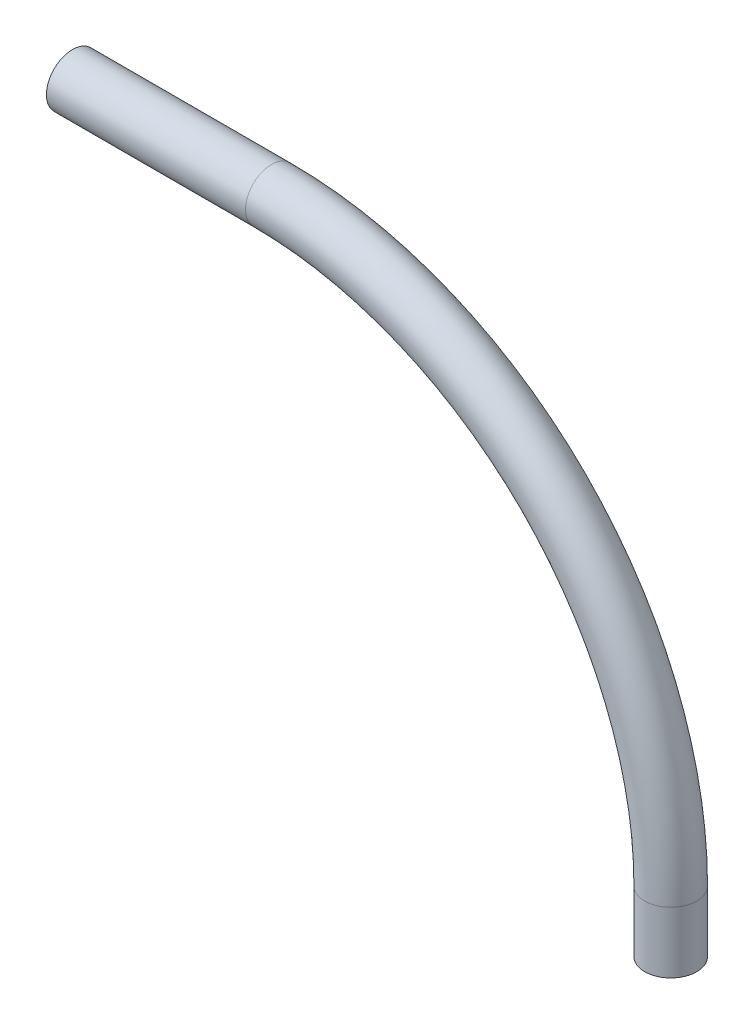
ISO-10303-21;
HEADER;
FILE_DESCRIPTION(('STEP AP214'),'2;1');
FILE_NAME('part.step','',(''),(''),'','','');
FILE_SCHEMA(('AUTOMOTIVE_DESIGN { 1 0 10303 214 1 1 1 1 }'));
ENDSEC;
DATA;
#1=APPLICATION_CONTEXT('core data for automotive mechanical design processes');
#2=APPLICATION_PROTOCOL_DEFINITION('international standard','automotive_design',2000,#1);
#3=PRODUCT_CONTEXT('',#1,'mechanical');
#4=PRODUCT('Part','Part','',(#3));
#5=PRODUCT_RELATED_PRODUCT_CATEGORY('part','',(#4));
#6=PRODUCT_DEFINITION_FORMATION('','',#4);
#7=PRODUCT_DEFINITION_CONTEXT('part definition',#1,'design');
#8=PRODUCT_DEFINITION('design','',#6,#7);
#9=PRODUCT_DEFINITION_SHAPE('','',#8);
#10=(LENGTH_UNIT() NAMED_UNIT(*) SI_UNIT(.MILLI.,.METRE.));
#11=(NAMED_UNIT(*) PLANE_ANGLE_UNIT() SI_UNIT($,.RADIAN.));
#12=(NAMED_UNIT(*) SI_UNIT($,.STERADIAN.) SOLID_ANGLE_UNIT());
#13=UNCERTAINTY_MEASURE_WITH_UNIT(LENGTH_MEASURE(1.E-05),#10,'distance_accuracy_value','');
#14=(GEOMETRIC_REPRESENTATION_CONTEXT(3) GLOBAL_UNCERTAINTY_ASSIGNED_CONTEXT((#13)) GLOBAL_UNIT_ASSIGNED_CONTEXT((#10,
#11,#12)) REPRESENTATION_CONTEXT('',''));
#15=CARTESIAN_POINT('',(0.,0.,0.));
#16=DIRECTION('',(0.,0.,1.));
#17=DIRECTION('',(1.,0.,0.));
#18=AXIS2_PLACEMENT_3D('',#15,#16,#17);
#19=CARTESIAN_POINT('',(-63.9532912683758,176.442341083977,4.91758167922948));
#20=DIRECTION('',(1.,0.,0.));
#21=DIRECTION('',(0.,0.,-1.));
#22=AXIS2_PLACEMENT_3D('',#19,#20,#21);
#23=CYLINDRICAL_SURFACE('',#22,8.5);
#24=CARTESIAN_POINT('',(1.04670873162423,176.442341083977,4.91758167922948));
#25=DIRECTION('',(1.,0.,0.));
#26=DIRECTION('',(0.,0.,-1.));
#27=AXIS2_PLACEMENT_3D('',#24,#25,#26);
#28=CIRCLE('',#27,8.5);
#29=CARTESIAN_POINT('',(1.04670873162424,184.942341083977,4.91758167922948));
#30=VERTEX_POINT('',#29);
#31=EDGE_CURVE('E57',#30,#30,#28,.T.);
#32=ORIENTED_EDGE('',*,*,#31,.F.);
#33=EDGE_LOOP('',(#32));
#34=FACE_BOUND('',#33,.T.);
#35=CARTESIAN_POINT('',(-63.9532912683758,176.442341083977,4.91758167922948));
#36=DIRECTION('',(1.,0.,0.));
#37=DIRECTION('',(0.,0.,-1.));
#38=AXIS2_PLACEMENT_3D('',#35,#36,#37);
#39=CIRCLE('',#38,8.5);
#40=CARTESIAN_POINT('',(-63.9532912683761,176.442341083977,-3.58241832077052));
#41=VERTEX_POINT('',#40);
#42=EDGE_CURVE('E55',#41,#41,#39,.T.);
#43=ORIENTED_EDGE('',*,*,#42,.T.);
#44=EDGE_LOOP('',(#43));
#45=FACE_BOUND('',#44,.T.);
#46=ADVANCED_FACE('F34',(#34,#45),#23,.T.);
#47=CARTESIAN_POINT('',(1.04670873162397,46.0623410839771,4.91758167922948));
#48=DIRECTION('',(0.,0.,-1.));
#49=DIRECTION('',(-1.,0.,0.));
#50=AXIS2_PLACEMENT_3D('',#47,#48,#49);
#51=TOROIDAL_SURFACE('',#50,130.38,8.5);
#52=CARTESIAN_POINT('',(131.426708731624,46.0623410839744,4.91758167922948));
#53=DIRECTION('',(0.,-1.,0.));
#54=DIRECTION('',(0.,0.,-1.));
#55=AXIS2_PLACEMENT_3D('',#52,#53,#54);
#56=CIRCLE('',#55,8.5);
#57=CARTESIAN_POINT('',(139.926708731624,46.0623410839742,4.91758167922948));
#58=VERTEX_POINT('',#57);
#59=EDGE_CURVE('E38',#58,#58,#56,.T.);
#60=CARTESIAN_POINT('',(1.04670873162397,46.0623410839771,4.91758167922948));
#61=DIRECTION('',(0.,0.,-1.));
#62=DIRECTION('',(-1.,0.,0.));
#63=AXIS2_PLACEMENT_3D('',#60,#61,#62);
#64=CIRCLE('',#63,138.88);
#65=EDGE_CURVE('',#30,#58,#64,.T.);
#66=ORIENTED_EDGE('',*,*,#31,.T.);
#67=ORIENTED_EDGE('',*,*,#59,.F.);
#68=ORIENTED_EDGE('',*,*,#65,.T.);
#69=ORIENTED_EDGE('',*,*,#65,.F.);
#70=EDGE_LOOP('',(#66,#68,#67,#69));
#71=FACE_BOUND('',#70,.T.);
#72=ADVANCED_FACE('F65',(#71),#51,.T.);
#73=CARTESIAN_POINT('',(131.426708731624,46.0623410839743,4.91758167922948));
#74=DIRECTION('',(0.,-1.,0.));
#75=DIRECTION('',(0.,0.,-1.));
#76=AXIS2_PLACEMENT_3D('',#73,#74,#75);
#77=CYLINDRICAL_SURFACE('',#76,8.5);
#78=CARTESIAN_POINT('',(131.426708731624,26.0623410839743,4.91758167922948));
#79=DIRECTION('',(0.,-1.,0.));
#80=DIRECTION('',(0.,0.,-1.));
#81=AXIS2_PLACEMENT_3D('',#78,#79,#80);
#82=CIRCLE('',#81,8.5);
#83=CARTESIAN_POINT('',(131.426708731624,26.0623410839746,-3.58241832077052));
#84=VERTEX_POINT('',#83);
#85=EDGE_CURVE('E51',#84,#84,#82,.T.);
#86=ORIENTED_EDGE('',*,*,#85,.F.);
#87=EDGE_LOOP('',(#86));
#88=FACE_BOUND('',#87,.T.);
#89=ORIENTED_EDGE('',*,*,#59,.T.);
#90=EDGE_LOOP('',(#89));
#91=FACE_BOUND('',#90,.T.);
#92=ADVANCED_FACE('F36',(#88,#91),#77,.T.);
#93=CARTESIAN_POINT('',(-63.9532912683758,176.442341083977,4.91758167922948));
#94=DIRECTION('',(1.,0.,0.));
#95=DIRECTION('',(0.,0.,-1.));
#96=AXIS2_PLACEMENT_3D('',#93,#94,#95);
#97=PLANE('',#96);
#98=CARTESIAN_POINT('',(-63.9532912683758,176.442341083977,4.91758167922948));
#99=DIRECTION('',(1.,0.,0.));
#100=DIRECTION('',(0.,0.,-1.));
#101=AXIS2_PLACEMENT_3D('',#98,#99,#100);
#102=CIRCLE('',#101,4.85);
#103=CARTESIAN_POINT('',(-63.9532912683759,176.442341083977,0.0675816792294849));
#104=VERTEX_POINT('',#103);
#105=EDGE_CURVE('E54',#104,#104,#102,.F.);
#106=ORIENTED_EDGE('',*,*,#105,.F.);
#107=EDGE_LOOP('',(#106));
#108=FACE_BOUND('',#107,.T.);
#109=ORIENTED_EDGE('',*,*,#42,.F.);
#110=EDGE_LOOP('',(#109));
#111=FACE_BOUND('',#110,.T.);
#112=ADVANCED_FACE('F71',(#108,#111),#97,.F.);
#113=CARTESIAN_POINT('',(131.426708731624,26.0623410839743,4.91758167922948));
#114=DIRECTION('',(0.,-1.,0.));
#115=DIRECTION('',(0.,0.,-1.));
#116=AXIS2_PLACEMENT_3D('',#113,#114,#115);
#117=PLANE('',#116);
#118=CARTESIAN_POINT('',(131.426708731624,26.0623410839743,4.91758167922948));
#119=DIRECTION('',(0.,-1.,0.));
#120=DIRECTION('',(0.,0.,-1.));
#121=AXIS2_PLACEMENT_3D('',#118,#119,#120);
#122=CIRCLE('',#121,4.85);
#123=CARTESIAN_POINT('',(131.426708731624,26.0623410839745,0.0675816792294849));
#124=VERTEX_POINT('',#123);
#125=EDGE_CURVE('E10',#124,#124,#122,.F.);
#126=ORIENTED_EDGE('',*,*,#125,.T.);
#127=EDGE_LOOP('',(#126));
#128=FACE_BOUND('',#127,.T.);
#129=ORIENTED_EDGE('',*,*,#85,.T.);
#130=EDGE_LOOP('',(#129));
#131=FACE_BOUND('',#130,.T.);
#132=ADVANCED_FACE('F89',(#128,#131),#117,.T.);
#133=CARTESIAN_POINT('',(-63.9532912683758,176.442341083977,4.91758167922948));
#134=DIRECTION('',(1.,0.,0.));
#135=DIRECTION('',(0.,0.,-1.));
#136=AXIS2_PLACEMENT_3D('',#133,#134,#135);
#137=CYLINDRICAL_SURFACE('',#136,4.85);
#138=CARTESIAN_POINT('',(1.04670873162423,176.442341083977,4.91758167922948));
#139=DIRECTION('',(1.,0.,0.));
#140=DIRECTION('',(0.,0.,-1.));
#141=AXIS2_PLACEMENT_3D('',#138,#139,#140);
#142=CIRCLE('',#141,4.85);
#143=CARTESIAN_POINT('',(1.04670873162424,181.292341083977,4.91758167922948));
#144=VERTEX_POINT('',#143);
#145=EDGE_CURVE('E47',#144,#144,#142,.F.);
#146=ORIENTED_EDGE('',*,*,#145,.F.);
#147=EDGE_LOOP('',(#146));
#148=FACE_BOUND('',#147,.T.);
#149=ORIENTED_EDGE('',*,*,#105,.T.);
#150=EDGE_LOOP('',(#149));
#151=FACE_BOUND('',#150,.T.);
#152=ADVANCED_FACE('F83',(#148,#151),#137,.F.);
#153=CARTESIAN_POINT('',(1.04670873162397,46.0623410839771,4.91758167922948));
#154=DIRECTION('',(0.,0.,-1.));
#155=DIRECTION('',(-1.,0.,0.));
#156=AXIS2_PLACEMENT_3D('',#153,#154,#155);
#157=TOROIDAL_SURFACE('',#156,130.38,4.85);
#158=CARTESIAN_POINT('',(131.426708731624,46.0623410839744,4.91758167922948));
#159=DIRECTION('',(0.,-1.,0.));
#160=DIRECTION('',(0.,0.,-1.));
#161=AXIS2_PLACEMENT_3D('',#158,#159,#160);
#162=CIRCLE('',#161,4.85);
#163=CARTESIAN_POINT('',(136.276708731624,46.0623410839743,4.91758167922948));
#164=VERTEX_POINT('',#163);
#165=EDGE_CURVE('E42',#164,#164,#162,.F.);
#166=CARTESIAN_POINT('',(1.04670873162397,46.0623410839771,4.91758167922948));
#167=DIRECTION('',(0.,0.,-1.));
#168=DIRECTION('',(-1.,0.,0.));
#169=AXIS2_PLACEMENT_3D('',#166,#167,#168);
#170=CIRCLE('',#169,135.23);
#171=EDGE_CURVE('',#144,#164,#170,.T.);
#172=ORIENTED_EDGE('',*,*,#145,.T.);
#173=ORIENTED_EDGE('',*,*,#165,.F.);
#174=ORIENTED_EDGE('',*,*,#171,.T.);
#175=ORIENTED_EDGE('',*,*,#171,.F.);
#176=EDGE_LOOP('',(#172,#174,#173,#175));
#177=FACE_BOUND('',#176,.T.);
#178=ADVANCED_FACE('F77',(#177),#157,.F.);
#179=CARTESIAN_POINT('',(131.426708731624,46.0623410839743,4.91758167922948));
#180=DIRECTION('',(0.,-1.,0.));
#181=DIRECTION('',(0.,0.,-1.));
#182=AXIS2_PLACEMENT_3D('',#179,#180,#181);
#183=CYLINDRICAL_SURFACE('',#182,4.85);
#184=ORIENTED_EDGE('',*,*,#125,.F.);
#185=EDGE_LOOP('',(#184));
#186=FACE_BOUND('',#185,.T.);
#187=ORIENTED_EDGE('',*,*,#165,.T.);
#188=EDGE_LOOP('',(#187));
#189=FACE_BOUND('',#188,.T.);
#190=ADVANCED_FACE('F75',(#186,#189),#183,.F.);
#191=CLOSED_SHELL('',(#46,#72,#92,#112,#132,#152,#178,#190));
#192=MANIFOLD_SOLID_BREP('B2',#191);
#193=ADVANCED_BREP_SHAPE_REPRESENTATION('',(#18,#192),#14);
#194=SHAPE_DEFINITION_REPRESENTATION(#9,#193);
ENDSEC;
END-ISO-10303-21;
